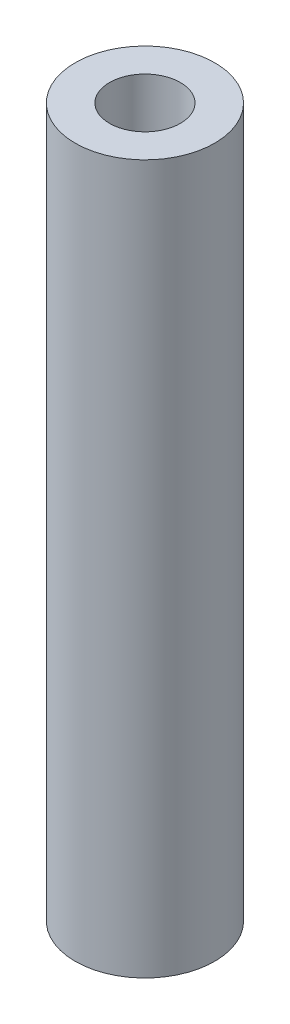
ISO-10303-21;
HEADER;
FILE_DESCRIPTION(('STEP AP214'),'2;1');
FILE_NAME('part.step','',(''),(''),'','','');
FILE_SCHEMA(('AUTOMOTIVE_DESIGN { 1 0 10303 214 1 1 1 1 }'));
ENDSEC;
DATA;
#1=APPLICATION_CONTEXT('core data for automotive mechanical design processes');
#2=APPLICATION_PROTOCOL_DEFINITION('international standard','automotive_design',2000,#1);
#3=PRODUCT_CONTEXT('',#1,'mechanical');
#4=PRODUCT('Part','Part','',(#3));
#5=PRODUCT_RELATED_PRODUCT_CATEGORY('part','',(#4));
#6=PRODUCT_DEFINITION_FORMATION('','',#4);
#7=PRODUCT_DEFINITION_CONTEXT('part definition',#1,'design');
#8=PRODUCT_DEFINITION('design','',#6,#7);
#9=PRODUCT_DEFINITION_SHAPE('','',#8);
#10=(LENGTH_UNIT() NAMED_UNIT(*) SI_UNIT(.MILLI.,.METRE.));
#11=(NAMED_UNIT(*) PLANE_ANGLE_UNIT() SI_UNIT($,.RADIAN.));
#12=(NAMED_UNIT(*) SI_UNIT($,.STERADIAN.) SOLID_ANGLE_UNIT());
#13=UNCERTAINTY_MEASURE_WITH_UNIT(LENGTH_MEASURE(1.E-05),#10,'distance_accuracy_value','');
#14=(GEOMETRIC_REPRESENTATION_CONTEXT(3) GLOBAL_UNCERTAINTY_ASSIGNED_CONTEXT((#13)) GLOBAL_UNIT_ASSIGNED_CONTEXT((#10,
#11,#12)) REPRESENTATION_CONTEXT('',''));
#15=CARTESIAN_POINT('',(0.,0.,0.));
#16=DIRECTION('',(0.,0.,1.));
#17=DIRECTION('',(1.,0.,0.));
#18=AXIS2_PLACEMENT_3D('',#15,#16,#17);
#19=CARTESIAN_POINT('',(0.,50.8,0.));
#20=DIRECTION('',(0.,1.,0.));
#21=DIRECTION('',(0.,0.,1.));
#22=AXIS2_PLACEMENT_3D('',#19,#20,#21);
#23=PLANE('',#22);
#24=CARTESIAN_POINT('',(0.,50.8,0.));
#25=DIRECTION('',(0.,1.,0.));
#26=DIRECTION('',(0.,0.,1.));
#27=AXIS2_PLACEMENT_3D('',#24,#25,#26);
#28=CIRCLE('',#27,5.);
#29=CARTESIAN_POINT('',(0.,50.8,5.));
#30=VERTEX_POINT('',#29);
#31=EDGE_CURVE('E10',#30,#30,#28,.T.);
#32=ORIENTED_EDGE('',*,*,#31,.T.);
#33=EDGE_LOOP('',(#32));
#34=FACE_BOUND('',#33,.T.);
#35=CARTESIAN_POINT('',(0.,50.8,0.));
#36=DIRECTION('',(0.,1.,0.));
#37=DIRECTION('',(0.,0.,1.));
#38=AXIS2_PLACEMENT_3D('',#35,#36,#37);
#39=CIRCLE('',#38,2.54);
#40=CARTESIAN_POINT('',(0.,50.8,2.54));
#41=VERTEX_POINT('',#40);
#42=EDGE_CURVE('E46',#41,#41,#39,.T.);
#43=ORIENTED_EDGE('',*,*,#42,.F.);
#44=EDGE_LOOP('',(#43));
#45=FACE_BOUND('',#44,.T.);
#46=ADVANCED_FACE('F35',(#34,#45),#23,.T.);
#47=CARTESIAN_POINT('',(0.,0.,0.));
#48=DIRECTION('',(0.,1.,0.));
#49=DIRECTION('',(0.,0.,1.));
#50=AXIS2_PLACEMENT_3D('',#47,#48,#49);
#51=PLANE('',#50);
#52=CARTESIAN_POINT('',(0.,0.,0.));
#53=DIRECTION('',(0.,1.,0.));
#54=DIRECTION('',(0.,0.,1.));
#55=AXIS2_PLACEMENT_3D('',#52,#53,#54);
#56=CIRCLE('',#55,5.);
#57=CARTESIAN_POINT('',(0.,0.,5.));
#58=VERTEX_POINT('',#57);
#59=EDGE_CURVE('E39',#58,#58,#56,.T.);
#60=ORIENTED_EDGE('',*,*,#59,.F.);
#61=EDGE_LOOP('',(#60));
#62=FACE_BOUND('',#61,.T.);
#63=CARTESIAN_POINT('',(0.,0.,0.));
#64=DIRECTION('',(0.,1.,0.));
#65=DIRECTION('',(0.,0.,1.));
#66=AXIS2_PLACEMENT_3D('',#63,#64,#65);
#67=CIRCLE('',#66,2.54);
#68=CARTESIAN_POINT('',(0.,0.,2.54));
#69=VERTEX_POINT('',#68);
#70=EDGE_CURVE('E48',#69,#69,#67,.T.);
#71=ORIENTED_EDGE('',*,*,#70,.T.);
#72=EDGE_LOOP('',(#71));
#73=FACE_BOUND('',#72,.T.);
#74=ADVANCED_FACE('F58',(#62,#73),#51,.F.);
#75=CARTESIAN_POINT('',(0.,50.8,0.));
#76=DIRECTION('',(0.,-1.,0.));
#77=DIRECTION('',(0.,0.,-1.));
#78=AXIS2_PLACEMENT_3D('',#75,#76,#77);
#79=CYLINDRICAL_SURFACE('',#78,5.);
#80=ORIENTED_EDGE('',*,*,#31,.F.);
#81=EDGE_LOOP('',(#80));
#82=FACE_BOUND('',#81,.T.);
#83=ORIENTED_EDGE('',*,*,#59,.T.);
#84=EDGE_LOOP('',(#83));
#85=FACE_BOUND('',#84,.T.);
#86=ADVANCED_FACE('F37',(#82,#85),#79,.T.);
#87=CARTESIAN_POINT('',(0.,50.8,0.));
#88=DIRECTION('',(0.,-1.,0.));
#89=DIRECTION('',(0.,0.,-1.));
#90=AXIS2_PLACEMENT_3D('',#87,#88,#89);
#91=CYLINDRICAL_SURFACE('',#90,2.54);
#92=ORIENTED_EDGE('',*,*,#42,.T.);
#93=EDGE_LOOP('',(#92));
#94=FACE_BOUND('',#93,.T.);
#95=ORIENTED_EDGE('',*,*,#70,.F.);
#96=EDGE_LOOP('',(#95));
#97=FACE_BOUND('',#96,.T.);
#98=ADVANCED_FACE('F54',(#94,#97),#91,.F.);
#99=CLOSED_SHELL('',(#46,#74,#86,#98));
#100=MANIFOLD_SOLID_BREP('B2',#99);
#101=ADVANCED_BREP_SHAPE_REPRESENTATION('',(#18,#100),#14);
#102=SHAPE_DEFINITION_REPRESENTATION(#9,#101);
ENDSEC;
END-ISO-10303-21;
